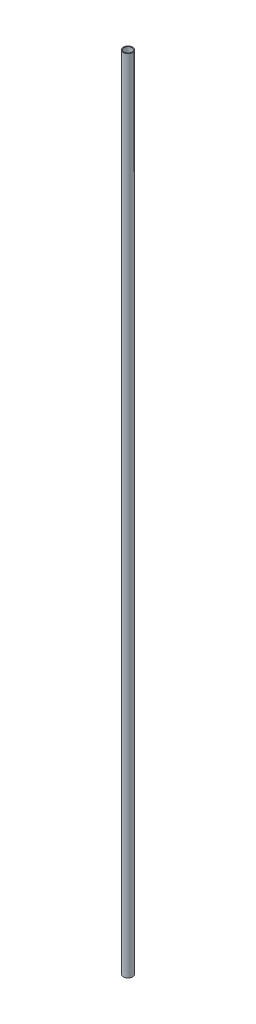
ISO-10303-21;
HEADER;
FILE_DESCRIPTION(('STEP AP214'),'2;1');
FILE_NAME('part.step','',(''),(''),'','','');
FILE_SCHEMA(('AUTOMOTIVE_DESIGN { 1 0 10303 214 1 1 1 1 }'));
ENDSEC;
DATA;
#1=APPLICATION_CONTEXT('core data for automotive mechanical design processes');
#2=APPLICATION_PROTOCOL_DEFINITION('international standard','automotive_design',2000,#1);
#3=PRODUCT_CONTEXT('',#1,'mechanical');
#4=PRODUCT('Part','Part','',(#3));
#5=PRODUCT_RELATED_PRODUCT_CATEGORY('part','',(#4));
#6=PRODUCT_DEFINITION_FORMATION('','',#4);
#7=PRODUCT_DEFINITION_CONTEXT('part definition',#1,'design');
#8=PRODUCT_DEFINITION('design','',#6,#7);
#9=PRODUCT_DEFINITION_SHAPE('','',#8);
#10=(LENGTH_UNIT() NAMED_UNIT(*) SI_UNIT(.MILLI.,.METRE.));
#11=(NAMED_UNIT(*) PLANE_ANGLE_UNIT() SI_UNIT($,.RADIAN.));
#12=(NAMED_UNIT(*) SI_UNIT($,.STERADIAN.) SOLID_ANGLE_UNIT());
#13=UNCERTAINTY_MEASURE_WITH_UNIT(LENGTH_MEASURE(1.E-05),#10,'distance_accuracy_value','');
#14=(GEOMETRIC_REPRESENTATION_CONTEXT(3) GLOBAL_UNCERTAINTY_ASSIGNED_CONTEXT((#13)) GLOBAL_UNIT_ASSIGNED_CONTEXT((#10,
#11,#12)) REPRESENTATION_CONTEXT('',''));
#15=CARTESIAN_POINT('',(0.,0.,0.));
#16=DIRECTION('',(0.,0.,1.));
#17=DIRECTION('',(1.,0.,0.));
#18=AXIS2_PLACEMENT_3D('',#15,#16,#17);
#19=CARTESIAN_POINT('',(0.,400.,0.));
#20=DIRECTION('',(0.,1.,0.));
#21=DIRECTION('',(0.,0.,1.));
#22=AXIS2_PLACEMENT_3D('',#19,#20,#21);
#23=PLANE('',#22);
#24=CARTESIAN_POINT('',(0.,400.,0.));
#25=DIRECTION('',(0.,1.,0.));
#26=DIRECTION('',(0.,0.,1.));
#27=AXIS2_PLACEMENT_3D('',#24,#25,#26);
#28=CIRCLE('',#27,2.35);
#29=CARTESIAN_POINT('',(0.,400.,2.35));
#30=VERTEX_POINT('',#29);
#31=EDGE_CURVE('E10',#30,#30,#28,.T.);
#32=ORIENTED_EDGE('',*,*,#31,.T.);
#33=EDGE_LOOP('',(#32));
#34=FACE_BOUND('',#33,.T.);
#35=CARTESIAN_POINT('',(0.,400.,0.));
#36=DIRECTION('',(0.,1.,0.));
#37=DIRECTION('',(0.,0.,1.));
#38=AXIS2_PLACEMENT_3D('',#35,#36,#37);
#39=CIRCLE('',#38,1.95);
#40=CARTESIAN_POINT('',(0.,400.,1.95));
#41=VERTEX_POINT('',#40);
#42=EDGE_CURVE('E40',#41,#41,#39,.T.);
#43=ORIENTED_EDGE('',*,*,#42,.F.);
#44=EDGE_LOOP('',(#43));
#45=FACE_BOUND('',#44,.T.);
#46=ADVANCED_FACE('F29',(#34,#45),#23,.T.);
#47=CARTESIAN_POINT('',(0.,0.,0.));
#48=DIRECTION('',(0.,1.,0.));
#49=DIRECTION('',(0.,0.,1.));
#50=AXIS2_PLACEMENT_3D('',#47,#48,#49);
#51=PLANE('',#50);
#52=CARTESIAN_POINT('',(0.,0.,0.));
#53=DIRECTION('',(0.,1.,0.));
#54=DIRECTION('',(0.,0.,1.));
#55=AXIS2_PLACEMENT_3D('',#52,#53,#54);
#56=CIRCLE('',#55,2.35);
#57=CARTESIAN_POINT('',(0.,0.,2.35));
#58=VERTEX_POINT('',#57);
#59=EDGE_CURVE('E33',#58,#58,#56,.T.);
#60=ORIENTED_EDGE('',*,*,#59,.F.);
#61=EDGE_LOOP('',(#60));
#62=FACE_BOUND('',#61,.T.);
#63=CARTESIAN_POINT('',(0.,0.,0.));
#64=DIRECTION('',(0.,1.,0.));
#65=DIRECTION('',(0.,0.,1.));
#66=AXIS2_PLACEMENT_3D('',#63,#64,#65);
#67=CIRCLE('',#66,1.95);
#68=CARTESIAN_POINT('',(0.,0.,1.95));
#69=VERTEX_POINT('',#68);
#70=EDGE_CURVE('E42',#69,#69,#67,.T.);
#71=ORIENTED_EDGE('',*,*,#70,.T.);
#72=EDGE_LOOP('',(#71));
#73=FACE_BOUND('',#72,.T.);
#74=ADVANCED_FACE('F52',(#62,#73),#51,.F.);
#75=CARTESIAN_POINT('',(0.,400.,0.));
#76=DIRECTION('',(0.,-1.,0.));
#77=DIRECTION('',(0.,0.,-1.));
#78=AXIS2_PLACEMENT_3D('',#75,#76,#77);
#79=CYLINDRICAL_SURFACE('',#78,2.35);
#80=ORIENTED_EDGE('',*,*,#31,.F.);
#81=EDGE_LOOP('',(#80));
#82=FACE_BOUND('',#81,.T.);
#83=ORIENTED_EDGE('',*,*,#59,.T.);
#84=EDGE_LOOP('',(#83));
#85=FACE_BOUND('',#84,.T.);
#86=ADVANCED_FACE('F31',(#82,#85),#79,.T.);
#87=CARTESIAN_POINT('',(0.,400.,0.));
#88=DIRECTION('',(0.,-1.,0.));
#89=DIRECTION('',(0.,0.,-1.));
#90=AXIS2_PLACEMENT_3D('',#87,#88,#89);
#91=CYLINDRICAL_SURFACE('',#90,1.95);
#92=ORIENTED_EDGE('',*,*,#42,.T.);
#93=EDGE_LOOP('',(#92));
#94=FACE_BOUND('',#93,.T.);
#95=ORIENTED_EDGE('',*,*,#70,.F.);
#96=EDGE_LOOP('',(#95));
#97=FACE_BOUND('',#96,.T.);
#98=ADVANCED_FACE('F48',(#94,#97),#91,.F.);
#99=CLOSED_SHELL('',(#46,#74,#86,#98));
#100=MANIFOLD_SOLID_BREP('B2',#99);
#101=ADVANCED_BREP_SHAPE_REPRESENTATION('',(#18,#100),#14);
#102=SHAPE_DEFINITION_REPRESENTATION(#9,#101);
ENDSEC;
END-ISO-10303-21;
